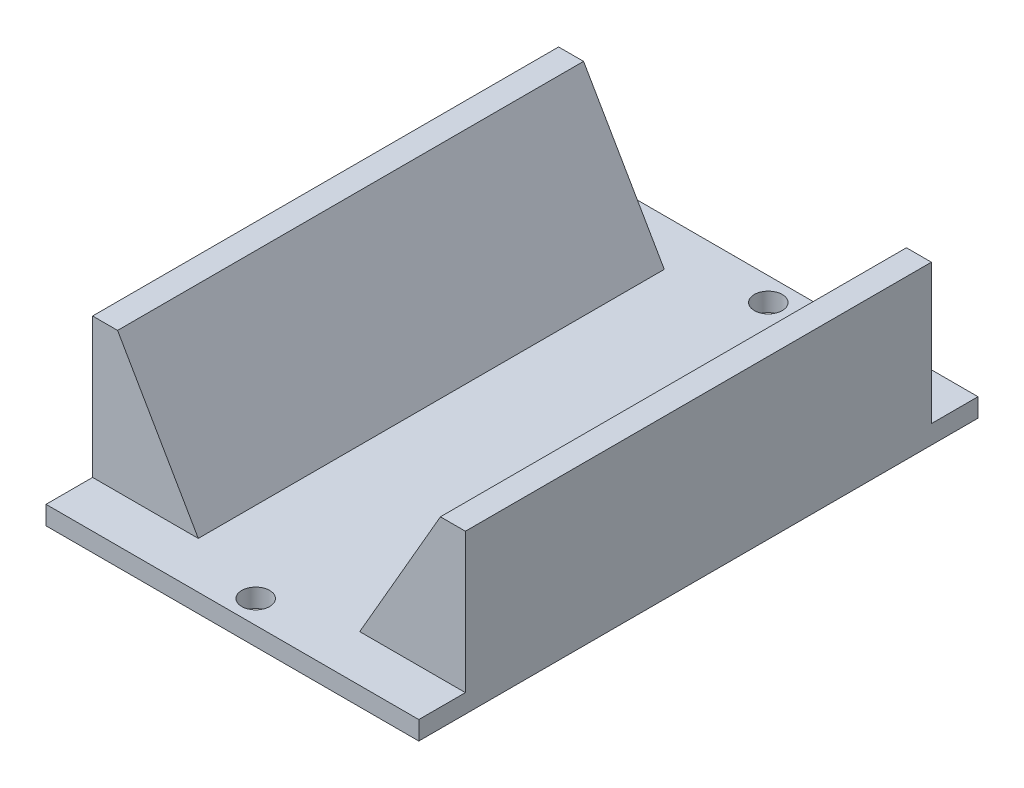
ISO-10303-21;
HEADER;
FILE_DESCRIPTION(('STEP AP214'),'2;1');
FILE_NAME('part.step','',(''),(''),'','','');
FILE_SCHEMA(('AUTOMOTIVE_DESIGN { 1 0 10303 214 1 1 1 1 }'));
ENDSEC;
DATA;
#1=APPLICATION_CONTEXT('core data for automotive mechanical design processes');
#2=APPLICATION_PROTOCOL_DEFINITION('international standard','automotive_design',2000,#1);
#3=PRODUCT_CONTEXT('',#1,'mechanical');
#4=PRODUCT('Part','Part','',(#3));
#5=PRODUCT_RELATED_PRODUCT_CATEGORY('part','',(#4));
#6=PRODUCT_DEFINITION_FORMATION('','',#4);
#7=PRODUCT_DEFINITION_CONTEXT('part definition',#1,'design');
#8=PRODUCT_DEFINITION('design','',#6,#7);
#9=PRODUCT_DEFINITION_SHAPE('','',#8);
#10=(LENGTH_UNIT() NAMED_UNIT(*) SI_UNIT(.MILLI.,.METRE.));
#11=(NAMED_UNIT(*) PLANE_ANGLE_UNIT() SI_UNIT($,.RADIAN.));
#12=(NAMED_UNIT(*) SI_UNIT($,.STERADIAN.) SOLID_ANGLE_UNIT());
#13=UNCERTAINTY_MEASURE_WITH_UNIT(LENGTH_MEASURE(1.E-05),#10,'distance_accuracy_value','');
#14=(GEOMETRIC_REPRESENTATION_CONTEXT(3) GLOBAL_UNCERTAINTY_ASSIGNED_CONTEXT((#13)) GLOBAL_UNIT_ASSIGNED_CONTEXT((#10,
#11,#12)) REPRESENTATION_CONTEXT('',''));
#15=CARTESIAN_POINT('',(0.,0.,0.));
#16=DIRECTION('',(0.,0.,1.));
#17=DIRECTION('',(1.,0.,0.));
#18=AXIS2_PLACEMENT_3D('',#15,#16,#17);
#19=CARTESIAN_POINT('',(0.,0.,0.));
#20=DIRECTION('',(0.,0.,1.));
#21=DIRECTION('',(1.,0.,0.));
#22=AXIS2_PLACEMENT_3D('',#19,#20,#21);
#23=PLANE('',#22);
#24=DIRECTION('',(0.,1.,0.));
#25=VECTOR('',#24,1.);
#26=CARTESIAN_POINT('',(20.,-17.,0.));
#27=LINE('',#26,#25);
#28=CARTESIAN_POINT('',(20.,-15.,0.));
#29=VERTEX_POINT('',#28);
#30=CARTESIAN_POINT('',(20.,0.,0.));
#31=VERTEX_POINT('',#30);
#32=EDGE_CURVE('E180',#29,#31,#27,.T.);
#33=ORIENTED_EDGE('',*,*,#32,.F.);
#34=DIRECTION('',(-1.,0.,0.));
#35=VECTOR('',#34,1.);
#36=CARTESIAN_POINT('',(-20.,-15.,0.));
#37=LINE('',#36,#35);
#38=CARTESIAN_POINT('',(8.66025403784438,-15.,0.));
#39=VERTEX_POINT('',#38);
#40=EDGE_CURVE('E48',#29,#39,#37,.T.);
#41=ORIENTED_EDGE('',*,*,#40,.T.);
#42=DIRECTION('',(-0.5,-0.866025403784439,0.));
#43=VECTOR('',#42,1.);
#44=CARTESIAN_POINT('',(8.66025403784438,-15.,0.));
#45=LINE('',#44,#43);
#46=CARTESIAN_POINT('',(17.3205080756888,0.,0.));
#47=VERTEX_POINT('',#46);
#48=EDGE_CURVE('E197',#47,#39,#45,.T.);
#49=ORIENTED_EDGE('',*,*,#48,.F.);
#50=DIRECTION('',(-1.,0.,0.));
#51=VECTOR('',#50,1.);
#52=CARTESIAN_POINT('',(20.,0.,0.));
#53=LINE('',#52,#51);
#54=EDGE_CURVE('E195',#31,#47,#53,.T.);
#55=ORIENTED_EDGE('',*,*,#54,.F.);
#56=EDGE_LOOP('',(#33,#41,#49,#55));
#57=FACE_BOUND('',#56,.T.);
#58=ADVANCED_FACE('F37',(#57),#23,.F.);
#59=CARTESIAN_POINT('',(0.,0.,50.));
#60=DIRECTION('',(0.,0.,1.));
#61=DIRECTION('',(1.,0.,0.));
#62=AXIS2_PLACEMENT_3D('',#59,#60,#61);
#63=PLANE('',#62);
#64=DIRECTION('',(-1.,0.,0.));
#65=VECTOR('',#64,1.);
#66=CARTESIAN_POINT('',(-20.,-15.,50.));
#67=LINE('',#66,#65);
#68=CARTESIAN_POINT('',(20.,-15.,50.));
#69=VERTEX_POINT('',#68);
#70=CARTESIAN_POINT('',(8.66025403784438,-15.,50.));
#71=VERTEX_POINT('',#70);
#72=EDGE_CURVE('E62',#69,#71,#67,.T.);
#73=ORIENTED_EDGE('',*,*,#72,.F.);
#74=DIRECTION('',(0.,1.,0.));
#75=VECTOR('',#74,1.);
#76=CARTESIAN_POINT('',(20.,-17.,50.));
#77=LINE('',#76,#75);
#78=CARTESIAN_POINT('',(20.,0.,50.));
#79=VERTEX_POINT('',#78);
#80=EDGE_CURVE('E181',#69,#79,#77,.T.);
#81=ORIENTED_EDGE('',*,*,#80,.T.);
#82=DIRECTION('',(-1.,0.,0.));
#83=VECTOR('',#82,1.);
#84=CARTESIAN_POINT('',(20.,0.,50.));
#85=LINE('',#84,#83);
#86=CARTESIAN_POINT('',(17.3205080756888,0.,50.));
#87=VERTEX_POINT('',#86);
#88=EDGE_CURVE('E183',#79,#87,#85,.T.);
#89=ORIENTED_EDGE('',*,*,#88,.T.);
#90=DIRECTION('',(-0.5,-0.866025403784439,0.));
#91=VECTOR('',#90,1.);
#92=CARTESIAN_POINT('',(8.66025403784438,-15.,50.));
#93=LINE('',#92,#91);
#94=EDGE_CURVE('E185',#87,#71,#93,.T.);
#95=ORIENTED_EDGE('',*,*,#94,.T.);
#96=EDGE_LOOP('',(#73,#81,#89,#95));
#97=FACE_BOUND('',#96,.T.);
#98=ADVANCED_FACE('F239',(#97),#63,.T.);
#99=CARTESIAN_POINT('',(-20.,-17.,50.));
#100=DIRECTION('',(0.,1.,0.));
#101=DIRECTION('',(0.,0.,1.));
#102=AXIS2_PLACEMENT_3D('',#99,#100,#101);
#103=PLANE('',#102);
#104=CARTESIAN_POINT('',(0.,-17.,-2.5));
#105=DIRECTION('',(0.,1.,0.));
#106=DIRECTION('',(0.,0.,1.));
#107=AXIS2_PLACEMENT_3D('',#104,#105,#106);
#108=CIRCLE('',#107,1.5);
#109=CARTESIAN_POINT('',(0.,-17.,-0.999999999999994));
#110=VERTEX_POINT('',#109);
#111=EDGE_CURVE('E426',#110,#110,#108,.T.);
#112=ORIENTED_EDGE('',*,*,#111,.T.);
#113=EDGE_LOOP('',(#112));
#114=FACE_BOUND('',#113,.T.);
#115=CARTESIAN_POINT('',(0.,-17.,52.5));
#116=DIRECTION('',(0.,1.,0.));
#117=DIRECTION('',(0.,0.,1.));
#118=AXIS2_PLACEMENT_3D('',#115,#116,#117);
#119=CIRCLE('',#118,1.5);
#120=CARTESIAN_POINT('',(0.,-17.,54.));
#121=VERTEX_POINT('',#120);
#122=EDGE_CURVE('E160',#121,#121,#119,.F.);
#123=ORIENTED_EDGE('',*,*,#122,.F.);
#124=EDGE_LOOP('',(#123));
#125=FACE_BOUND('',#124,.T.);
#126=DIRECTION('',(0.,0.,-1.));
#127=VECTOR('',#126,1.);
#128=CARTESIAN_POINT('',(-20.,-17.,50.));
#129=LINE('',#128,#127);
#130=CARTESIAN_POINT('',(-20.,-17.,55.));
#131=VERTEX_POINT('',#130);
#132=CARTESIAN_POINT('',(-20.,-17.,-5.));
#133=VERTEX_POINT('',#132);
#134=EDGE_CURVE('E193',#131,#133,#129,.T.);
#135=ORIENTED_EDGE('',*,*,#134,.T.);
#136=DIRECTION('',(1.,0.,0.));
#137=VECTOR('',#136,1.);
#138=CARTESIAN_POINT('',(-20.,-17.,-5.));
#139=LINE('',#138,#137);
#140=CARTESIAN_POINT('',(20.,-17.,-5.));
#141=VERTEX_POINT('',#140);
#142=EDGE_CURVE('E145',#133,#141,#139,.T.);
#143=ORIENTED_EDGE('',*,*,#142,.T.);
#144=DIRECTION('',(0.,0.,-1.));
#145=VECTOR('',#144,1.);
#146=CARTESIAN_POINT('',(20.,-17.,50.));
#147=LINE('',#146,#145);
#148=CARTESIAN_POINT('',(20.,-17.,55.));
#149=VERTEX_POINT('',#148);
#150=EDGE_CURVE('E41',#149,#141,#147,.T.);
#151=ORIENTED_EDGE('',*,*,#150,.F.);
#152=DIRECTION('',(1.,0.,0.));
#153=VECTOR('',#152,1.);
#154=CARTESIAN_POINT('',(-20.,-17.,55.));
#155=LINE('',#154,#153);
#156=EDGE_CURVE('E166',#131,#149,#155,.T.);
#157=ORIENTED_EDGE('',*,*,#156,.F.);
#158=EDGE_LOOP('',(#135,#143,#151,#157));
#159=FACE_BOUND('',#158,.T.);
#160=ADVANCED_FACE('F39',(#114,#125,#159),#103,.F.);
#161=CARTESIAN_POINT('',(20.,-17.,50.));
#162=DIRECTION('',(-1.,0.,0.));
#163=DIRECTION('',(0.,-1.,0.));
#164=AXIS2_PLACEMENT_3D('',#161,#162,#163);
#165=PLANE('',#164);
#166=ORIENTED_EDGE('',*,*,#150,.T.);
#167=DIRECTION('',(0.,1.,0.));
#168=VECTOR('',#167,1.);
#169=CARTESIAN_POINT('',(20.,-17.,-5.));
#170=LINE('',#169,#168);
#171=CARTESIAN_POINT('',(20.,-15.,-5.));
#172=VERTEX_POINT('',#171);
#173=EDGE_CURVE('E150',#141,#172,#170,.T.);
#174=ORIENTED_EDGE('',*,*,#173,.T.);
#175=DIRECTION('',(0.,0.,1.));
#176=VECTOR('',#175,1.);
#177=CARTESIAN_POINT('',(20.,-15.,-5.));
#178=LINE('',#177,#176);
#179=EDGE_CURVE('E136',#172,#29,#178,.T.);
#180=ORIENTED_EDGE('',*,*,#179,.T.);
#181=ORIENTED_EDGE('',*,*,#32,.T.);
#182=DIRECTION('',(0.,0.,-1.));
#183=VECTOR('',#182,1.);
#184=CARTESIAN_POINT('',(20.,0.,50.));
#185=LINE('',#184,#183);
#186=EDGE_CURVE('E218',#79,#31,#185,.T.);
#187=ORIENTED_EDGE('',*,*,#186,.F.);
#188=ORIENTED_EDGE('',*,*,#80,.F.);
#189=DIRECTION('',(0.,0.,-1.));
#190=VECTOR('',#189,1.);
#191=CARTESIAN_POINT('',(20.,-15.,55.));
#192=LINE('',#191,#190);
#193=CARTESIAN_POINT('',(20.,-15.,55.));
#194=VERTEX_POINT('',#193);
#195=EDGE_CURVE('E177',#194,#69,#192,.T.);
#196=ORIENTED_EDGE('',*,*,#195,.F.);
#197=DIRECTION('',(0.,1.,0.));
#198=VECTOR('',#197,1.);
#199=CARTESIAN_POINT('',(20.,-17.,55.));
#200=LINE('',#199,#198);
#201=EDGE_CURVE('E169',#149,#194,#200,.T.);
#202=ORIENTED_EDGE('',*,*,#201,.F.);
#203=EDGE_LOOP('',(#166,#174,#180,#181,#187,#188,#196,#202));
#204=FACE_BOUND('',#203,.T.);
#205=ADVANCED_FACE('F238',(#204),#165,.F.);
#206=CARTESIAN_POINT('',(20.,0.,50.));
#207=DIRECTION('',(0.,-1.,0.));
#208=DIRECTION('',(1.,0.,0.));
#209=AXIS2_PLACEMENT_3D('',#206,#207,#208);
#210=PLANE('',#209);
#211=ORIENTED_EDGE('',*,*,#54,.T.);
#212=DIRECTION('',(0.,0.,-1.));
#213=VECTOR('',#212,1.);
#214=CARTESIAN_POINT('',(17.3205080756888,0.,50.));
#215=LINE('',#214,#213);
#216=EDGE_CURVE('E216',#87,#47,#215,.T.);
#217=ORIENTED_EDGE('',*,*,#216,.F.);
#218=ORIENTED_EDGE('',*,*,#88,.F.);
#219=ORIENTED_EDGE('',*,*,#186,.T.);
#220=EDGE_LOOP('',(#211,#217,#218,#219));
#221=FACE_BOUND('',#220,.T.);
#222=ADVANCED_FACE('F243',(#221),#210,.F.);
#223=CARTESIAN_POINT('',(8.66025403784438,-15.,50.));
#224=DIRECTION('',(0.866025403784439,-0.5,0.));
#225=DIRECTION('',(0.5,0.866025403784439,0.));
#226=AXIS2_PLACEMENT_3D('',#223,#224,#225);
#227=PLANE('',#226);
#228=ORIENTED_EDGE('',*,*,#48,.T.);
#229=DIRECTION('',(0.,0.,-1.));
#230=VECTOR('',#229,1.);
#231=CARTESIAN_POINT('',(8.66025403784438,-15.,50.));
#232=LINE('',#231,#230);
#233=EDGE_CURVE('E214',#71,#39,#232,.T.);
#234=ORIENTED_EDGE('',*,*,#233,.F.);
#235=ORIENTED_EDGE('',*,*,#94,.F.);
#236=ORIENTED_EDGE('',*,*,#216,.T.);
#237=EDGE_LOOP('',(#228,#234,#235,#236));
#238=FACE_BOUND('',#237,.T.);
#239=ADVANCED_FACE('F246',(#238),#227,.F.);
#240=CARTESIAN_POINT('',(-8.66025403784439,-15.,50.));
#241=DIRECTION('',(0.,-1.,0.));
#242=DIRECTION('',(0.,0.,-1.));
#243=AXIS2_PLACEMENT_3D('',#240,#241,#242);
#244=PLANE('',#243);
#245=CARTESIAN_POINT('',(0.,-15.,-2.5));
#246=DIRECTION('',(0.,-1.,0.));
#247=DIRECTION('',(0.,0.,-1.));
#248=AXIS2_PLACEMENT_3D('',#245,#246,#247);
#249=CIRCLE('',#248,1.5);
#250=CARTESIAN_POINT('',(0.,-15.,-4.));
#251=VERTEX_POINT('',#250);
#252=EDGE_CURVE('E156',#251,#251,#249,.T.);
#253=ORIENTED_EDGE('',*,*,#252,.T.);
#254=EDGE_LOOP('',(#253));
#255=FACE_BOUND('',#254,.T.);
#256=CARTESIAN_POINT('',(0.,-15.,52.5));
#257=DIRECTION('',(0.,1.,0.));
#258=DIRECTION('',(0.,0.,1.));
#259=AXIS2_PLACEMENT_3D('',#256,#257,#258);
#260=CIRCLE('',#259,1.5);
#261=CARTESIAN_POINT('',(0.,-15.,54.));
#262=VERTEX_POINT('',#261);
#263=EDGE_CURVE('E135',#262,#262,#260,.T.);
#264=ORIENTED_EDGE('',*,*,#263,.F.);
#265=EDGE_LOOP('',(#264));
#266=FACE_BOUND('',#265,.T.);
#267=ORIENTED_EDGE('',*,*,#233,.T.);
#268=ORIENTED_EDGE('',*,*,#40,.F.);
#269=ORIENTED_EDGE('',*,*,#179,.F.);
#270=DIRECTION('',(-1.,0.,0.));
#271=VECTOR('',#270,1.);
#272=CARTESIAN_POINT('',(-20.,-15.,-5.));
#273=LINE('',#272,#271);
#274=CARTESIAN_POINT('',(-20.,-15.,-5.));
#275=VERTEX_POINT('',#274);
#276=EDGE_CURVE('E142',#172,#275,#273,.T.);
#277=ORIENTED_EDGE('',*,*,#276,.T.);
#278=DIRECTION('',(0.,0.,1.));
#279=VECTOR('',#278,1.);
#280=CARTESIAN_POINT('',(-20.,-15.,-5.));
#281=LINE('',#280,#279);
#282=CARTESIAN_POINT('',(-20.,-15.,0.));
#283=VERTEX_POINT('',#282);
#284=EDGE_CURVE('E55',#275,#283,#281,.T.);
#285=ORIENTED_EDGE('',*,*,#284,.T.);
#286=CARTESIAN_POINT('',(-8.66025403784439,-15.,0.));
#287=VERTEX_POINT('',#286);
#288=EDGE_CURVE('E11',#287,#283,#37,.T.);
#289=ORIENTED_EDGE('',*,*,#288,.F.);
#290=DIRECTION('',(0.,0.,-1.));
#291=VECTOR('',#290,1.);
#292=CARTESIAN_POINT('',(-8.66025403784439,-15.,50.));
#293=LINE('',#292,#291);
#294=CARTESIAN_POINT('',(-8.66025403784439,-15.,50.));
#295=VERTEX_POINT('',#294);
#296=EDGE_CURVE('E211',#295,#287,#293,.T.);
#297=ORIENTED_EDGE('',*,*,#296,.F.);
#298=CARTESIAN_POINT('',(-20.,-15.,50.));
#299=VERTEX_POINT('',#298);
#300=EDGE_CURVE('E46',#295,#299,#67,.T.);
#301=ORIENTED_EDGE('',*,*,#300,.T.);
#302=DIRECTION('',(0.,0.,-1.));
#303=VECTOR('',#302,1.);
#304=CARTESIAN_POINT('',(-20.,-15.,55.));
#305=LINE('',#304,#303);
#306=CARTESIAN_POINT('',(-20.,-15.,55.));
#307=VERTEX_POINT('',#306);
#308=EDGE_CURVE('E173',#307,#299,#305,.T.);
#309=ORIENTED_EDGE('',*,*,#308,.F.);
#310=DIRECTION('',(-1.,0.,0.));
#311=VECTOR('',#310,1.);
#312=CARTESIAN_POINT('',(-20.,-15.,55.));
#313=LINE('',#312,#311);
#314=EDGE_CURVE('E171',#194,#307,#313,.T.);
#315=ORIENTED_EDGE('',*,*,#314,.F.);
#316=ORIENTED_EDGE('',*,*,#195,.T.);
#317=ORIENTED_EDGE('',*,*,#72,.T.);
#318=EDGE_LOOP('',(#267,#268,#269,#277,#285,#289,#297,#301,#309,#315,#316,#317));
#319=FACE_BOUND('',#318,.T.);
#320=ADVANCED_FACE('F148',(#255,#266,#319),#244,.F.);
#321=CARTESIAN_POINT('',(-17.3205080756888,0.,50.));
#322=DIRECTION('',(-0.866025403784439,-0.5,0.));
#323=DIRECTION('',(0.5,-0.866025403784439,0.));
#324=AXIS2_PLACEMENT_3D('',#321,#322,#323);
#325=PLANE('',#324);
#326=DIRECTION('',(-0.5,0.866025403784439,0.));
#327=VECTOR('',#326,1.);
#328=CARTESIAN_POINT('',(-17.3205080756888,0.,0.));
#329=LINE('',#328,#327);
#330=CARTESIAN_POINT('',(-17.3205080756888,0.,0.));
#331=VERTEX_POINT('',#330);
#332=EDGE_CURVE('E200',#287,#331,#329,.T.);
#333=ORIENTED_EDGE('',*,*,#332,.T.);
#334=DIRECTION('',(0.,0.,-1.));
#335=VECTOR('',#334,1.);
#336=CARTESIAN_POINT('',(-17.3205080756888,0.,50.));
#337=LINE('',#336,#335);
#338=CARTESIAN_POINT('',(-17.3205080756888,0.,50.));
#339=VERTEX_POINT('',#338);
#340=EDGE_CURVE('E208',#339,#331,#337,.T.);
#341=ORIENTED_EDGE('',*,*,#340,.F.);
#342=DIRECTION('',(-0.5,0.866025403784439,0.));
#343=VECTOR('',#342,1.);
#344=CARTESIAN_POINT('',(-17.3205080756888,0.,50.));
#345=LINE('',#344,#343);
#346=EDGE_CURVE('E187',#295,#339,#345,.T.);
#347=ORIENTED_EDGE('',*,*,#346,.F.);
#348=ORIENTED_EDGE('',*,*,#296,.T.);
#349=EDGE_LOOP('',(#333,#341,#347,#348));
#350=FACE_BOUND('',#349,.T.);
#351=ADVANCED_FACE('F278',(#350),#325,.F.);
#352=CARTESIAN_POINT('',(-17.3205080756888,0.,50.));
#353=DIRECTION('',(0.,-1.,0.));
#354=DIRECTION('',(1.,0.,0.));
#355=AXIS2_PLACEMENT_3D('',#352,#353,#354);
#356=PLANE('',#355);
#357=DIRECTION('',(-1.,0.,0.));
#358=VECTOR('',#357,1.);
#359=CARTESIAN_POINT('',(-17.3205080756888,0.,0.));
#360=LINE('',#359,#358);
#361=CARTESIAN_POINT('',(-20.,0.,0.));
#362=VERTEX_POINT('',#361);
#363=EDGE_CURVE('E202',#331,#362,#360,.T.);
#364=ORIENTED_EDGE('',*,*,#363,.T.);
#365=DIRECTION('',(0.,0.,-1.));
#366=VECTOR('',#365,1.);
#367=CARTESIAN_POINT('',(-20.,0.,50.));
#368=LINE('',#367,#366);
#369=CARTESIAN_POINT('',(-20.,0.,50.));
#370=VERTEX_POINT('',#369);
#371=EDGE_CURVE('E206',#370,#362,#368,.T.);
#372=ORIENTED_EDGE('',*,*,#371,.F.);
#373=DIRECTION('',(-1.,0.,0.));
#374=VECTOR('',#373,1.);
#375=CARTESIAN_POINT('',(-17.3205080756888,0.,50.));
#376=LINE('',#375,#374);
#377=EDGE_CURVE('E189',#339,#370,#376,.T.);
#378=ORIENTED_EDGE('',*,*,#377,.F.);
#379=ORIENTED_EDGE('',*,*,#340,.T.);
#380=EDGE_LOOP('',(#364,#372,#378,#379));
#381=FACE_BOUND('',#380,.T.);
#382=ADVANCED_FACE('F281',(#381),#356,.F.);
#383=CARTESIAN_POINT('',(-20.,0.,50.));
#384=DIRECTION('',(1.,0.,0.));
#385=DIRECTION('',(0.,1.,0.));
#386=AXIS2_PLACEMENT_3D('',#383,#384,#385);
#387=PLANE('',#386);
#388=DIRECTION('',(0.,-1.,0.));
#389=VECTOR('',#388,1.);
#390=CARTESIAN_POINT('',(-20.,0.,0.));
#391=LINE('',#390,#389);
#392=EDGE_CURVE('E134',#362,#283,#391,.T.);
#393=ORIENTED_EDGE('',*,*,#392,.T.);
#394=ORIENTED_EDGE('',*,*,#284,.F.);
#395=DIRECTION('',(0.,-1.,0.));
#396=VECTOR('',#395,1.);
#397=CARTESIAN_POINT('',(-20.,-17.,-5.));
#398=LINE('',#397,#396);
#399=EDGE_CURVE('E130',#275,#133,#398,.T.);
#400=ORIENTED_EDGE('',*,*,#399,.T.);
#401=ORIENTED_EDGE('',*,*,#134,.F.);
#402=DIRECTION('',(0.,-1.,0.));
#403=VECTOR('',#402,1.);
#404=CARTESIAN_POINT('',(-20.,-17.,55.));
#405=LINE('',#404,#403);
#406=EDGE_CURVE('E163',#307,#131,#405,.T.);
#407=ORIENTED_EDGE('',*,*,#406,.F.);
#408=ORIENTED_EDGE('',*,*,#308,.T.);
#409=DIRECTION('',(0.,-1.,0.));
#410=VECTOR('',#409,1.);
#411=CARTESIAN_POINT('',(-20.,0.,50.));
#412=LINE('',#411,#410);
#413=EDGE_CURVE('E191',#370,#299,#412,.T.);
#414=ORIENTED_EDGE('',*,*,#413,.F.);
#415=ORIENTED_EDGE('',*,*,#371,.T.);
#416=EDGE_LOOP('',(#393,#394,#400,#401,#407,#408,#414,#415));
#417=FACE_BOUND('',#416,.T.);
#418=ADVANCED_FACE('F129',(#417),#387,.F.);
#419=ORIENTED_EDGE('',*,*,#300,.F.);
#420=ORIENTED_EDGE('',*,*,#346,.T.);
#421=ORIENTED_EDGE('',*,*,#377,.T.);
#422=ORIENTED_EDGE('',*,*,#413,.T.);
#423=EDGE_LOOP('',(#419,#420,#421,#422));
#424=FACE_BOUND('',#423,.T.);
#425=ADVANCED_FACE('F257',(#424),#63,.T.);
#426=ORIENTED_EDGE('',*,*,#332,.F.);
#427=ORIENTED_EDGE('',*,*,#288,.T.);
#428=ORIENTED_EDGE('',*,*,#392,.F.);
#429=ORIENTED_EDGE('',*,*,#363,.F.);
#430=EDGE_LOOP('',(#426,#427,#428,#429));
#431=FACE_BOUND('',#430,.T.);
#432=ADVANCED_FACE('F262',(#431),#23,.F.);
#433=CARTESIAN_POINT('',(0.,0.,55.));
#434=DIRECTION('',(0.,0.,-1.));
#435=DIRECTION('',(-1.,0.,0.));
#436=AXIS2_PLACEMENT_3D('',#433,#434,#435);
#437=PLANE('',#436);
#438=ORIENTED_EDGE('',*,*,#406,.T.);
#439=ORIENTED_EDGE('',*,*,#156,.T.);
#440=ORIENTED_EDGE('',*,*,#201,.T.);
#441=ORIENTED_EDGE('',*,*,#314,.T.);
#442=EDGE_LOOP('',(#438,#439,#440,#441));
#443=FACE_BOUND('',#442,.T.);
#444=ADVANCED_FACE('F236',(#443),#437,.F.);
#445=CARTESIAN_POINT('',(0.,-17.001,52.5));
#446=DIRECTION('',(0.,1.,0.));
#447=DIRECTION('',(0.,0.,1.));
#448=AXIS2_PLACEMENT_3D('',#445,#446,#447);
#449=CYLINDRICAL_SURFACE('',#448,1.5);
#450=ORIENTED_EDGE('',*,*,#263,.T.);
#451=EDGE_LOOP('',(#450));
#452=FACE_BOUND('',#451,.T.);
#453=ORIENTED_EDGE('',*,*,#122,.T.);
#454=EDGE_LOOP('',(#453));
#455=FACE_BOUND('',#454,.T.);
#456=ADVANCED_FACE('F272',(#452,#455),#449,.F.);
#457=CARTESIAN_POINT('',(0.,0.,-5.));
#458=DIRECTION('',(0.,0.,1.));
#459=DIRECTION('',(-1.,0.,0.));
#460=AXIS2_PLACEMENT_3D('',#457,#458,#459);
#461=PLANE('',#460);
#462=ORIENTED_EDGE('',*,*,#399,.F.);
#463=ORIENTED_EDGE('',*,*,#276,.F.);
#464=ORIENTED_EDGE('',*,*,#173,.F.);
#465=ORIENTED_EDGE('',*,*,#142,.F.);
#466=EDGE_LOOP('',(#462,#463,#464,#465));
#467=FACE_BOUND('',#466,.T.);
#468=ADVANCED_FACE('F140',(#467),#461,.F.);
#469=CARTESIAN_POINT('',(0.,-17.001,-2.5));
#470=DIRECTION('',(0.,1.,0.));
#471=DIRECTION('',(0.,0.,1.));
#472=AXIS2_PLACEMENT_3D('',#469,#470,#471);
#473=CYLINDRICAL_SURFACE('',#472,1.5);
#474=ORIENTED_EDGE('',*,*,#252,.F.);
#475=EDGE_LOOP('',(#474));
#476=FACE_BOUND('',#475,.T.);
#477=ORIENTED_EDGE('',*,*,#111,.F.);
#478=EDGE_LOOP('',(#477));
#479=FACE_BOUND('',#478,.T.);
#480=ADVANCED_FACE('F337',(#476,#479),#473,.F.);
#481=CLOSED_SHELL('',(#58,#98,#160,#205,#222,#239,#320,#351,#382,#418,#425,#432,#444,#456,#468,#480));
#482=MANIFOLD_SOLID_BREP('B2',#481);
#483=ADVANCED_BREP_SHAPE_REPRESENTATION('',(#18,#482),#14);
#484=SHAPE_DEFINITION_REPRESENTATION(#9,#483);
ENDSEC;
END-ISO-10303-21;
